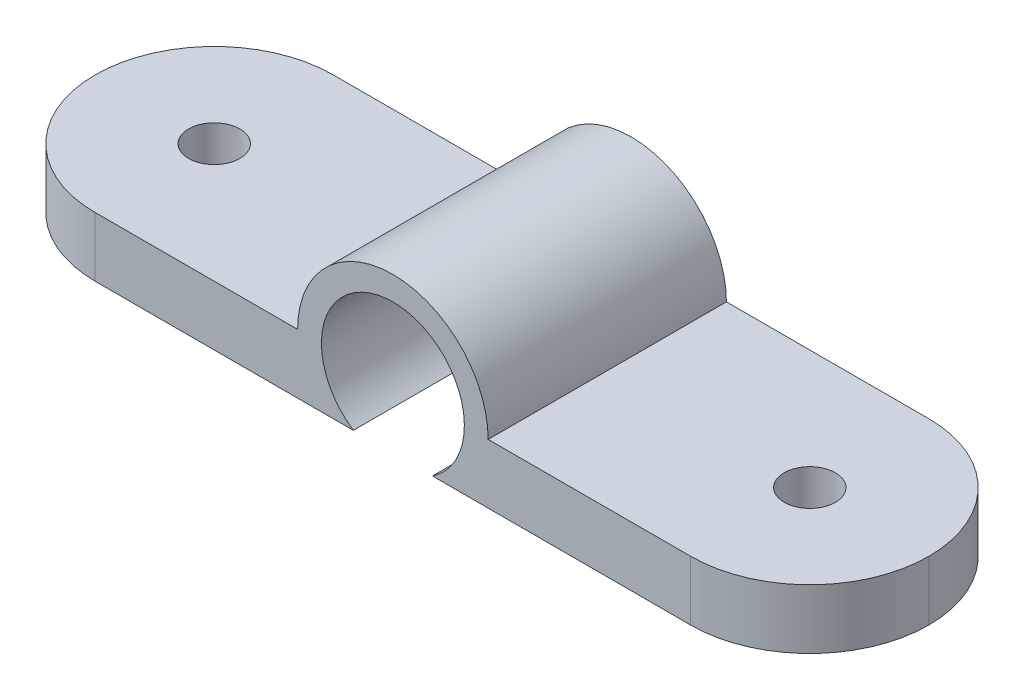
ISO-10303-21;
HEADER;
FILE_DESCRIPTION(('STEP AP214'),'2;1');
FILE_NAME('part.step','',(''),(''),'','','');
FILE_SCHEMA(('AUTOMOTIVE_DESIGN { 1 0 10303 214 1 1 1 1 }'));
ENDSEC;
DATA;
#1=APPLICATION_CONTEXT('core data for automotive mechanical design processes');
#2=APPLICATION_PROTOCOL_DEFINITION('international standard','automotive_design',2000,#1);
#3=PRODUCT_CONTEXT('',#1,'mechanical');
#4=PRODUCT('Part','Part','',(#3));
#5=PRODUCT_RELATED_PRODUCT_CATEGORY('part','',(#4));
#6=PRODUCT_DEFINITION_FORMATION('','',#4);
#7=PRODUCT_DEFINITION_CONTEXT('part definition',#1,'design');
#8=PRODUCT_DEFINITION('design','',#6,#7);
#9=PRODUCT_DEFINITION_SHAPE('','',#8);
#10=(LENGTH_UNIT() NAMED_UNIT(*) SI_UNIT(.MILLI.,.METRE.));
#11=(NAMED_UNIT(*) PLANE_ANGLE_UNIT() SI_UNIT($,.RADIAN.));
#12=(NAMED_UNIT(*) SI_UNIT($,.STERADIAN.) SOLID_ANGLE_UNIT());
#13=UNCERTAINTY_MEASURE_WITH_UNIT(LENGTH_MEASURE(1.E-05),#10,'distance_accuracy_value','');
#14=(GEOMETRIC_REPRESENTATION_CONTEXT(3) GLOBAL_UNCERTAINTY_ASSIGNED_CONTEXT((#13)) GLOBAL_UNIT_ASSIGNED_CONTEXT((#10,
#11,#12)) REPRESENTATION_CONTEXT('',''));
#15=CARTESIAN_POINT('',(0.,0.,0.));
#16=DIRECTION('',(0.,0.,1.));
#17=DIRECTION('',(1.,0.,0.));
#18=AXIS2_PLACEMENT_3D('',#15,#16,#17);
#19=CARTESIAN_POINT('',(0.,0.,0.));
#20=DIRECTION('',(0.,-1.,0.));
#21=DIRECTION('',(0.,0.,-1.));
#22=AXIS2_PLACEMENT_3D('',#19,#20,#21);
#23=PLANE('',#22);
#24=DIRECTION('',(0.,0.,-1.));
#25=VECTOR('',#24,1.);
#26=CARTESIAN_POINT('',(-25.5565398646654,0.,0.));
#27=LINE('',#26,#25);
#28=CARTESIAN_POINT('',(-25.5565398646654,0.,0.));
#29=VERTEX_POINT('',#28);
#30=CARTESIAN_POINT('',(-25.5565398646654,0.,-20.));
#31=VERTEX_POINT('',#30);
#32=EDGE_CURVE('E11',#29,#31,#27,.T.);
#33=ORIENTED_EDGE('',*,*,#32,.F.);
#34=DIRECTION('',(1.,0.,0.));
#35=VECTOR('',#34,1.);
#36=CARTESIAN_POINT('',(12.76008492569,0.,0.));
#37=LINE('',#36,#35);
#38=CARTESIAN_POINT('',(-47.23991507431,0.,0.));
#39=VERTEX_POINT('',#38);
#40=EDGE_CURVE('E142',#39,#29,#37,.T.);
#41=ORIENTED_EDGE('',*,*,#40,.F.);
#42=CARTESIAN_POINT('',(-47.23991507431,0.,-10.));
#43=DIRECTION('',(0.,-1.,0.));
#44=DIRECTION('',(0.,0.,-1.));
#45=AXIS2_PLACEMENT_3D('',#42,#43,#44);
#46=CIRCLE('',#45,10.);
#47=CARTESIAN_POINT('',(-57.23991507431,0.,-9.99999999999999));
#48=VERTEX_POINT('',#47);
#49=EDGE_CURVE('E153',#39,#48,#46,.T.);
#50=ORIENTED_EDGE('',*,*,#49,.T.);
#51=CARTESIAN_POINT('',(-47.23991507431,0.,-9.99999999999999));
#52=DIRECTION('',(0.,-1.,0.));
#53=DIRECTION('',(0.,0.,-1.));
#54=AXIS2_PLACEMENT_3D('',#51,#52,#53);
#55=CIRCLE('',#54,10.);
#56=CARTESIAN_POINT('',(-47.23991507431,0.,-20.));
#57=VERTEX_POINT('',#56);
#58=EDGE_CURVE('E139',#48,#57,#55,.T.);
#59=ORIENTED_EDGE('',*,*,#58,.T.);
#60=DIRECTION('',(-1.,0.,0.));
#61=VECTOR('',#60,1.);
#62=CARTESIAN_POINT('',(-57.23991507431,0.,-20.));
#63=LINE('',#62,#61);
#64=EDGE_CURVE('E131',#31,#57,#63,.T.);
#65=ORIENTED_EDGE('',*,*,#64,.F.);
#66=EDGE_LOOP('',(#33,#41,#50,#59,#65));
#67=FACE_BOUND('',#66,.T.);
#68=CARTESIAN_POINT('',(-47.23991507431,0.,-9.99999999999999));
#69=DIRECTION('',(0.,-1.,0.));
#70=DIRECTION('',(0.,0.,-1.));
#71=AXIS2_PLACEMENT_3D('',#68,#69,#70);
#72=CIRCLE('',#71,2.15);
#73=CARTESIAN_POINT('',(-47.23991507431,0.,-12.15));
#74=VERTEX_POINT('',#73);
#75=EDGE_CURVE('E197',#74,#74,#72,.T.);
#76=ORIENTED_EDGE('',*,*,#75,.F.);
#77=EDGE_LOOP('',(#76));
#78=FACE_BOUND('',#77,.T.);
#79=ADVANCED_FACE('F45',(#67,#78),#23,.T.);
#80=CARTESIAN_POINT('',(0.,5.,0.));
#81=DIRECTION('',(0.,-1.,0.));
#82=DIRECTION('',(0.,0.,-1.));
#83=AXIS2_PLACEMENT_3D('',#80,#81,#82);
#84=PLANE('',#83);
#85=CARTESIAN_POINT('',(-47.23991507431,5.,-9.99999999999999));
#86=DIRECTION('',(0.,1.,0.));
#87=DIRECTION('',(0.,0.,1.));
#88=AXIS2_PLACEMENT_3D('',#85,#86,#87);
#89=CIRCLE('',#88,2.15);
#90=CARTESIAN_POINT('',(-47.23991507431,5.,-7.84999999999999));
#91=VERTEX_POINT('',#90);
#92=EDGE_CURVE('E202',#91,#91,#89,.T.);
#93=ORIENTED_EDGE('',*,*,#92,.F.);
#94=EDGE_LOOP('',(#93));
#95=FACE_BOUND('',#94,.T.);
#96=DIRECTION('',(1.,0.,0.));
#97=VECTOR('',#96,1.);
#98=CARTESIAN_POINT('',(12.76008492569,5.,0.));
#99=LINE('',#98,#97);
#100=CARTESIAN_POINT('',(-47.23991507431,5.,0.));
#101=VERTEX_POINT('',#100);
#102=CARTESIAN_POINT('',(-30.23991507431,5.,0.));
#103=VERTEX_POINT('',#102);
#104=EDGE_CURVE('E241',#101,#103,#99,.T.);
#105=ORIENTED_EDGE('',*,*,#104,.T.);
#106=DIRECTION('',(0.,0.,-1.));
#107=VECTOR('',#106,1.);
#108=CARTESIAN_POINT('',(-30.23991507431,5.,0.));
#109=LINE('',#108,#107);
#110=CARTESIAN_POINT('',(-30.23991507431,5.,-20.));
#111=VERTEX_POINT('',#110);
#112=EDGE_CURVE('E225',#103,#111,#109,.T.);
#113=ORIENTED_EDGE('',*,*,#112,.T.);
#114=DIRECTION('',(-1.,0.,0.));
#115=VECTOR('',#114,1.);
#116=CARTESIAN_POINT('',(-57.23991507431,5.,-20.));
#117=LINE('',#116,#115);
#118=CARTESIAN_POINT('',(-47.23991507431,5.,-20.));
#119=VERTEX_POINT('',#118);
#120=EDGE_CURVE('E243',#111,#119,#117,.T.);
#121=ORIENTED_EDGE('',*,*,#120,.T.);
#122=CARTESIAN_POINT('',(-47.23991507431,5.,-9.99999999999999));
#123=DIRECTION('',(0.,-1.,0.));
#124=DIRECTION('',(0.,0.,-1.));
#125=AXIS2_PLACEMENT_3D('',#122,#123,#124);
#126=CIRCLE('',#125,10.);
#127=CARTESIAN_POINT('',(-57.23991507431,5.,-9.99999999999999));
#128=VERTEX_POINT('',#127);
#129=EDGE_CURVE('E171',#119,#128,#126,.F.);
#130=ORIENTED_EDGE('',*,*,#129,.T.);
#131=CARTESIAN_POINT('',(-47.23991507431,5.,-10.));
#132=DIRECTION('',(0.,-1.,0.));
#133=DIRECTION('',(0.,0.,-1.));
#134=AXIS2_PLACEMENT_3D('',#131,#132,#133);
#135=CIRCLE('',#134,10.);
#136=EDGE_CURVE('E174',#128,#101,#135,.F.);
#137=ORIENTED_EDGE('',*,*,#136,.T.);
#138=EDGE_LOOP('',(#105,#113,#121,#130,#137));
#139=FACE_BOUND('',#138,.T.);
#140=ADVANCED_FACE('F247',(#95,#139),#84,.F.);
#141=CARTESIAN_POINT('',(12.76008492569,5.,0.));
#142=DIRECTION('',(0.,0.,-1.));
#143=DIRECTION('',(-1.,0.,0.));
#144=AXIS2_PLACEMENT_3D('',#141,#142,#143);
#145=PLANE('',#144);
#146=ORIENTED_EDGE('',*,*,#40,.T.);
#147=CARTESIAN_POINT('',(-22.23991507431,5.,0.));
#148=DIRECTION('',(0.,0.,-1.));
#149=DIRECTION('',(-1.,0.,0.));
#150=AXIS2_PLACEMENT_3D('',#147,#148,#149);
#151=CIRCLE('',#150,6.);
#152=CARTESIAN_POINT('',(-18.9232902839546,0.,0.));
#153=VERTEX_POINT('',#152);
#154=EDGE_CURVE('E122',#29,#153,#151,.T.);
#155=ORIENTED_EDGE('',*,*,#154,.T.);
#156=CARTESIAN_POINT('',(2.76008492569005,0.,0.));
#157=VERTEX_POINT('',#156);
#158=EDGE_CURVE('E147',#153,#157,#37,.T.);
#159=ORIENTED_EDGE('',*,*,#158,.T.);
#160=DIRECTION('',(0.,-1.,0.));
#161=VECTOR('',#160,1.);
#162=CARTESIAN_POINT('',(2.76008492569005,5.,0.));
#163=LINE('',#162,#161);
#164=CARTESIAN_POINT('',(2.76008492569005,5.,0.));
#165=VERTEX_POINT('',#164);
#166=EDGE_CURVE('E167',#157,#165,#163,.F.);
#167=ORIENTED_EDGE('',*,*,#166,.T.);
#168=CARTESIAN_POINT('',(-14.23991507431,5.,0.));
#169=VERTEX_POINT('',#168);
#170=EDGE_CURVE('E146',#169,#165,#99,.T.);
#171=ORIENTED_EDGE('',*,*,#170,.F.);
#172=CARTESIAN_POINT('',(-22.23991507431,5.,0.));
#173=DIRECTION('',(0.,0.,-1.));
#174=DIRECTION('',(1.,0.,0.));
#175=AXIS2_PLACEMENT_3D('',#172,#173,#174);
#176=CIRCLE('',#175,8.);
#177=EDGE_CURVE('E232',#103,#169,#176,.T.);
#178=ORIENTED_EDGE('',*,*,#177,.F.);
#179=ORIENTED_EDGE('',*,*,#104,.F.);
#180=DIRECTION('',(0.,-1.,0.));
#181=VECTOR('',#180,1.);
#182=CARTESIAN_POINT('',(-47.23991507431,5.,0.));
#183=LINE('',#182,#181);
#184=EDGE_CURVE('E163',#101,#39,#183,.T.);
#185=ORIENTED_EDGE('',*,*,#184,.T.);
#186=EDGE_LOOP('',(#146,#155,#159,#167,#171,#178,#179,#185));
#187=FACE_BOUND('',#186,.T.);
#188=ADVANCED_FACE('F209',(#187),#145,.F.);
#189=CARTESIAN_POINT('',(-57.23991507431,5.,-20.));
#190=DIRECTION('',(0.,0.,1.));
#191=DIRECTION('',(1.,0.,0.));
#192=AXIS2_PLACEMENT_3D('',#189,#190,#191);
#193=PLANE('',#192);
#194=CARTESIAN_POINT('',(2.76008492569004,0.,-20.));
#195=VERTEX_POINT('',#194);
#196=CARTESIAN_POINT('',(-18.9232902839546,0.,-20.));
#197=VERTEX_POINT('',#196);
#198=EDGE_CURVE('E134',#195,#197,#63,.T.);
#199=ORIENTED_EDGE('',*,*,#198,.T.);
#200=CARTESIAN_POINT('',(-22.23991507431,5.,-20.));
#201=DIRECTION('',(0.,0.,-1.));
#202=DIRECTION('',(-1.,0.,0.));
#203=AXIS2_PLACEMENT_3D('',#200,#201,#202);
#204=CIRCLE('',#203,6.);
#205=EDGE_CURVE('E60',#31,#197,#204,.T.);
#206=ORIENTED_EDGE('',*,*,#205,.F.);
#207=ORIENTED_EDGE('',*,*,#64,.T.);
#208=DIRECTION('',(0.,-1.,0.));
#209=VECTOR('',#208,1.);
#210=CARTESIAN_POINT('',(-47.23991507431,5.,-20.));
#211=LINE('',#210,#209);
#212=EDGE_CURVE('E183',#57,#119,#211,.F.);
#213=ORIENTED_EDGE('',*,*,#212,.T.);
#214=ORIENTED_EDGE('',*,*,#120,.F.);
#215=CARTESIAN_POINT('',(-22.23991507431,5.,-20.));
#216=DIRECTION('',(0.,0.,-1.));
#217=DIRECTION('',(1.,0.,0.));
#218=AXIS2_PLACEMENT_3D('',#215,#216,#217);
#219=CIRCLE('',#218,8.);
#220=CARTESIAN_POINT('',(-14.23991507431,5.,-20.));
#221=VERTEX_POINT('',#220);
#222=EDGE_CURVE('E211',#111,#221,#219,.T.);
#223=ORIENTED_EDGE('',*,*,#222,.T.);
#224=CARTESIAN_POINT('',(2.76008492569004,5.,-20.));
#225=VERTEX_POINT('',#224);
#226=EDGE_CURVE('E68',#225,#221,#117,.T.);
#227=ORIENTED_EDGE('',*,*,#226,.F.);
#228=DIRECTION('',(0.,-1.,0.));
#229=VECTOR('',#228,1.);
#230=CARTESIAN_POINT('',(2.76008492569004,5.,-20.));
#231=LINE('',#230,#229);
#232=EDGE_CURVE('E186',#225,#195,#231,.T.);
#233=ORIENTED_EDGE('',*,*,#232,.T.);
#234=EDGE_LOOP('',(#199,#206,#207,#213,#214,#223,#227,#233));
#235=FACE_BOUND('',#234,.T.);
#236=ADVANCED_FACE('F129',(#235),#193,.F.);
#237=CARTESIAN_POINT('',(2.76008492569004,5.,-9.99999999999999));
#238=DIRECTION('',(0.,1.,0.));
#239=DIRECTION('',(0.,0.,1.));
#240=AXIS2_PLACEMENT_3D('',#237,#238,#239);
#241=CIRCLE('',#240,2.15);
#242=CARTESIAN_POINT('',(2.76008492569004,5.,-7.84999999999999));
#243=VERTEX_POINT('',#242);
#244=EDGE_CURVE('E221',#243,#243,#241,.T.);
#245=ORIENTED_EDGE('',*,*,#244,.F.);
#246=EDGE_LOOP('',(#245));
#247=FACE_BOUND('',#246,.T.);
#248=ORIENTED_EDGE('',*,*,#226,.T.);
#249=DIRECTION('',(0.,0.,-1.));
#250=VECTOR('',#249,1.);
#251=CARTESIAN_POINT('',(-14.23991507431,5.,0.));
#252=LINE('',#251,#250);
#253=EDGE_CURVE('E229',#169,#221,#252,.T.);
#254=ORIENTED_EDGE('',*,*,#253,.F.);
#255=ORIENTED_EDGE('',*,*,#170,.T.);
#256=CARTESIAN_POINT('',(2.76008492569005,5.,-10.));
#257=DIRECTION('',(0.,-1.,0.));
#258=DIRECTION('',(0.,0.,-1.));
#259=AXIS2_PLACEMENT_3D('',#256,#257,#258);
#260=CIRCLE('',#259,10.);
#261=CARTESIAN_POINT('',(12.76008492569,5.,-10.));
#262=VERTEX_POINT('',#261);
#263=EDGE_CURVE('E180',#165,#262,#260,.F.);
#264=ORIENTED_EDGE('',*,*,#263,.T.);
#265=CARTESIAN_POINT('',(2.76008492569004,5.,-9.99999999999999));
#266=DIRECTION('',(0.,-1.,0.));
#267=DIRECTION('',(0.,0.,-1.));
#268=AXIS2_PLACEMENT_3D('',#265,#266,#267);
#269=CIRCLE('',#268,10.);
#270=EDGE_CURVE('E177',#262,#225,#269,.F.);
#271=ORIENTED_EDGE('',*,*,#270,.T.);
#272=EDGE_LOOP('',(#248,#254,#255,#264,#271));
#273=FACE_BOUND('',#272,.T.);
#274=ADVANCED_FACE('F261',(#247,#273),#84,.F.);
#275=DIRECTION('',(0.,0.,-1.));
#276=VECTOR('',#275,1.);
#277=CARTESIAN_POINT('',(-18.9232902839546,0.,0.));
#278=LINE('',#277,#276);
#279=EDGE_CURVE('E54',#197,#153,#278,.F.);
#280=ORIENTED_EDGE('',*,*,#279,.F.);
#281=ORIENTED_EDGE('',*,*,#198,.F.);
#282=CARTESIAN_POINT('',(2.76008492569004,0.,-9.99999999999999));
#283=DIRECTION('',(0.,-1.,0.));
#284=DIRECTION('',(0.,0.,-1.));
#285=AXIS2_PLACEMENT_3D('',#282,#283,#284);
#286=CIRCLE('',#285,10.);
#287=CARTESIAN_POINT('',(12.76008492569,0.,-10.));
#288=VERTEX_POINT('',#287);
#289=EDGE_CURVE('E156',#195,#288,#286,.T.);
#290=ORIENTED_EDGE('',*,*,#289,.T.);
#291=CARTESIAN_POINT('',(2.76008492569005,0.,-10.));
#292=DIRECTION('',(0.,-1.,0.));
#293=DIRECTION('',(0.,0.,-1.));
#294=AXIS2_PLACEMENT_3D('',#291,#292,#293);
#295=CIRCLE('',#294,10.);
#296=EDGE_CURVE('E159',#288,#157,#295,.T.);
#297=ORIENTED_EDGE('',*,*,#296,.T.);
#298=ORIENTED_EDGE('',*,*,#158,.F.);
#299=EDGE_LOOP('',(#280,#281,#290,#297,#298));
#300=FACE_BOUND('',#299,.T.);
#301=CARTESIAN_POINT('',(2.76008492569004,0.,-9.99999999999999));
#302=DIRECTION('',(0.,-1.,0.));
#303=DIRECTION('',(0.,0.,-1.));
#304=AXIS2_PLACEMENT_3D('',#301,#302,#303);
#305=CIRCLE('',#304,2.15);
#306=CARTESIAN_POINT('',(2.76008492569004,0.,-12.15));
#307=VERTEX_POINT('',#306);
#308=EDGE_CURVE('E198',#307,#307,#305,.T.);
#309=ORIENTED_EDGE('',*,*,#308,.F.);
#310=EDGE_LOOP('',(#309));
#311=FACE_BOUND('',#310,.T.);
#312=ADVANCED_FACE('F213',(#300,#311),#23,.T.);
#313=CARTESIAN_POINT('',(2.76008492569004,5.,-9.99999999999999));
#314=DIRECTION('',(0.,-1.,0.));
#315=DIRECTION('',(0.,0.,-1.));
#316=AXIS2_PLACEMENT_3D('',#313,#314,#315);
#317=CYLINDRICAL_SURFACE('',#316,10.);
#318=ORIENTED_EDGE('',*,*,#232,.F.);
#319=ORIENTED_EDGE('',*,*,#270,.F.);
#320=DIRECTION('',(0.,-1.,0.));
#321=VECTOR('',#320,1.);
#322=CARTESIAN_POINT('',(12.76008492569,5.,-10.));
#323=LINE('',#322,#321);
#324=EDGE_CURVE('E189',#288,#262,#323,.F.);
#325=ORIENTED_EDGE('',*,*,#324,.F.);
#326=ORIENTED_EDGE('',*,*,#289,.F.);
#327=EDGE_LOOP('',(#318,#319,#325,#326));
#328=FACE_BOUND('',#327,.T.);
#329=ADVANCED_FACE('F271',(#328),#317,.T.);
#330=CARTESIAN_POINT('',(2.76008492569005,5.,-10.));
#331=DIRECTION('',(0.,-1.,0.));
#332=DIRECTION('',(0.,0.,-1.));
#333=AXIS2_PLACEMENT_3D('',#330,#331,#332);
#334=CYLINDRICAL_SURFACE('',#333,10.);
#335=ORIENTED_EDGE('',*,*,#263,.F.);
#336=ORIENTED_EDGE('',*,*,#166,.F.);
#337=ORIENTED_EDGE('',*,*,#296,.F.);
#338=ORIENTED_EDGE('',*,*,#324,.T.);
#339=EDGE_LOOP('',(#335,#336,#337,#338));
#340=FACE_BOUND('',#339,.T.);
#341=ADVANCED_FACE('F266',(#340),#334,.T.);
#342=CARTESIAN_POINT('',(-47.23991507431,5.,-9.99999999999999));
#343=DIRECTION('',(0.,-1.,0.));
#344=DIRECTION('',(0.,0.,-1.));
#345=AXIS2_PLACEMENT_3D('',#342,#343,#344);
#346=CYLINDRICAL_SURFACE('',#345,10.);
#347=DIRECTION('',(0.,-1.,0.));
#348=VECTOR('',#347,1.);
#349=CARTESIAN_POINT('',(-57.23991507431,5.,-9.99999999999999));
#350=LINE('',#349,#348);
#351=EDGE_CURVE('E193',#128,#48,#350,.T.);
#352=ORIENTED_EDGE('',*,*,#351,.F.);
#353=ORIENTED_EDGE('',*,*,#129,.F.);
#354=ORIENTED_EDGE('',*,*,#212,.F.);
#355=ORIENTED_EDGE('',*,*,#58,.F.);
#356=EDGE_LOOP('',(#352,#353,#354,#355));
#357=FACE_BOUND('',#356,.T.);
#358=ADVANCED_FACE('F47',(#357),#346,.T.);
#359=CARTESIAN_POINT('',(-47.23991507431,5.,-10.));
#360=DIRECTION('',(0.,-1.,0.));
#361=DIRECTION('',(0.,0.,-1.));
#362=AXIS2_PLACEMENT_3D('',#359,#360,#361);
#363=CYLINDRICAL_SURFACE('',#362,10.);
#364=ORIENTED_EDGE('',*,*,#136,.F.);
#365=ORIENTED_EDGE('',*,*,#351,.T.);
#366=ORIENTED_EDGE('',*,*,#49,.F.);
#367=ORIENTED_EDGE('',*,*,#184,.F.);
#368=EDGE_LOOP('',(#364,#365,#366,#367));
#369=FACE_BOUND('',#368,.T.);
#370=ADVANCED_FACE('F255',(#369),#363,.T.);
#371=CARTESIAN_POINT('',(2.76008492569004,-5.,-9.99999999999999));
#372=DIRECTION('',(0.,1.,0.));
#373=DIRECTION('',(0.,0.,1.));
#374=AXIS2_PLACEMENT_3D('',#371,#372,#373);
#375=CYLINDRICAL_SURFACE('',#374,2.15);
#376=ORIENTED_EDGE('',*,*,#308,.T.);
#377=EDGE_LOOP('',(#376));
#378=FACE_BOUND('',#377,.T.);
#379=ORIENTED_EDGE('',*,*,#244,.T.);
#380=EDGE_LOOP('',(#379));
#381=FACE_BOUND('',#380,.T.);
#382=ADVANCED_FACE('F343',(#378,#381),#375,.F.);
#383=CARTESIAN_POINT('',(-47.23991507431,-5.,-9.99999999999999));
#384=DIRECTION('',(0.,1.,0.));
#385=DIRECTION('',(0.,0.,1.));
#386=AXIS2_PLACEMENT_3D('',#383,#384,#385);
#387=CYLINDRICAL_SURFACE('',#386,2.15);
#388=ORIENTED_EDGE('',*,*,#75,.T.);
#389=EDGE_LOOP('',(#388));
#390=FACE_BOUND('',#389,.T.);
#391=ORIENTED_EDGE('',*,*,#92,.T.);
#392=EDGE_LOOP('',(#391));
#393=FACE_BOUND('',#392,.T.);
#394=ADVANCED_FACE('F325',(#390,#393),#387,.F.);
#395=CARTESIAN_POINT('',(-22.23991507431,5.,0.));
#396=DIRECTION('',(0.,0.,-1.));
#397=DIRECTION('',(-1.,0.,0.));
#398=AXIS2_PLACEMENT_3D('',#395,#396,#397);
#399=CYLINDRICAL_SURFACE('',#398,8.);
#400=ORIENTED_EDGE('',*,*,#222,.F.);
#401=ORIENTED_EDGE('',*,*,#112,.F.);
#402=ORIENTED_EDGE('',*,*,#177,.T.);
#403=ORIENTED_EDGE('',*,*,#253,.T.);
#404=EDGE_LOOP('',(#400,#401,#402,#403));
#405=FACE_BOUND('',#404,.T.);
#406=ADVANCED_FACE('F260',(#405),#399,.T.);
#407=CARTESIAN_POINT('',(-22.23991507431,5.,0.));
#408=DIRECTION('',(0.,0.,-1.));
#409=DIRECTION('',(-1.,0.,0.));
#410=AXIS2_PLACEMENT_3D('',#407,#408,#409);
#411=CYLINDRICAL_SURFACE('',#410,6.);
#412=ORIENTED_EDGE('',*,*,#32,.T.);
#413=ORIENTED_EDGE('',*,*,#205,.T.);
#414=ORIENTED_EDGE('',*,*,#279,.T.);
#415=ORIENTED_EDGE('',*,*,#154,.F.);
#416=EDGE_LOOP('',(#412,#413,#414,#415));
#417=FACE_BOUND('',#416,.T.);
#418=ADVANCED_FACE('F120',(#417),#411,.F.);
#419=CLOSED_SHELL('',(#79,#140,#188,#236,#274,#312,#329,#341,#358,#370,#382,#394,#406,#418));
#420=MANIFOLD_SOLID_BREP('B2',#419);
#421=ADVANCED_BREP_SHAPE_REPRESENTATION('',(#18,#420),#14);
#422=SHAPE_DEFINITION_REPRESENTATION(#9,#421);
ENDSEC;
END-ISO-10303-21;
